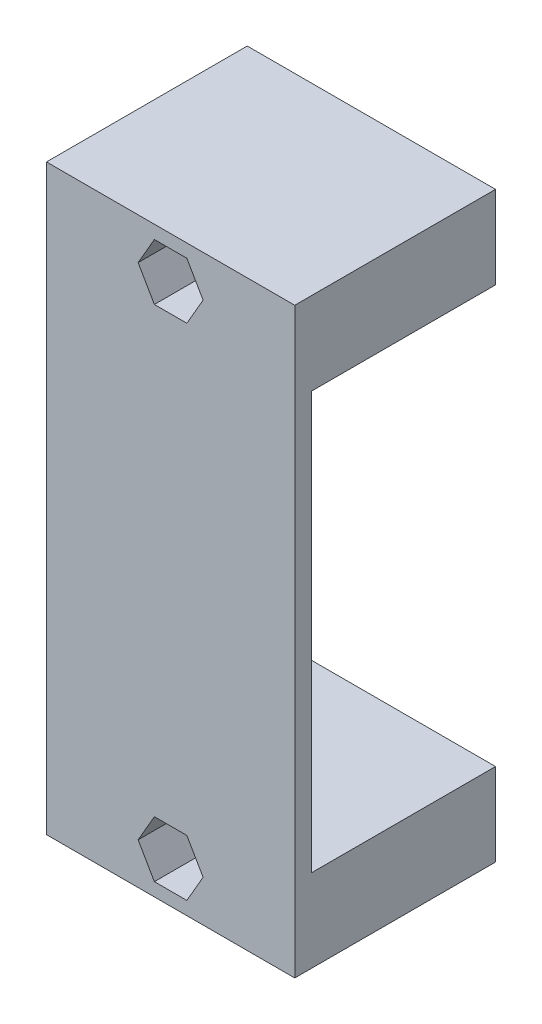
ISO-10303-21;
HEADER;
FILE_DESCRIPTION(('STEP AP214'),'2;1');
FILE_NAME('part.step','',(''),(''),'','','');
FILE_SCHEMA(('AUTOMOTIVE_DESIGN { 1 0 10303 214 1 1 1 1 }'));
ENDSEC;
DATA;
#1=APPLICATION_CONTEXT('core data for automotive mechanical design processes');
#2=APPLICATION_PROTOCOL_DEFINITION('international standard','automotive_design',2000,#1);
#3=PRODUCT_CONTEXT('',#1,'mechanical');
#4=PRODUCT('Part','Part','',(#3));
#5=PRODUCT_RELATED_PRODUCT_CATEGORY('part','',(#4));
#6=PRODUCT_DEFINITION_FORMATION('','',#4);
#7=PRODUCT_DEFINITION_CONTEXT('part definition',#1,'design');
#8=PRODUCT_DEFINITION('design','',#6,#7);
#9=PRODUCT_DEFINITION_SHAPE('','',#8);
#10=(LENGTH_UNIT() NAMED_UNIT(*) SI_UNIT(.MILLI.,.METRE.));
#11=(NAMED_UNIT(*) PLANE_ANGLE_UNIT() SI_UNIT($,.RADIAN.));
#12=(NAMED_UNIT(*) SI_UNIT($,.STERADIAN.) SOLID_ANGLE_UNIT());
#13=UNCERTAINTY_MEASURE_WITH_UNIT(LENGTH_MEASURE(1.E-05),#10,'distance_accuracy_value','');
#14=(GEOMETRIC_REPRESENTATION_CONTEXT(3) GLOBAL_UNCERTAINTY_ASSIGNED_CONTEXT((#13)) GLOBAL_UNIT_ASSIGNED_CONTEXT((#10,
#11,#12)) REPRESENTATION_CONTEXT('',''));
#15=CARTESIAN_POINT('',(0.,0.,0.));
#16=DIRECTION('',(0.,0.,1.));
#17=DIRECTION('',(1.,0.,0.));
#18=AXIS2_PLACEMENT_3D('',#15,#16,#17);
#19=CARTESIAN_POINT('',(-22.5,-27.,2.));
#20=DIRECTION('',(0.,0.,-1.));
#21=DIRECTION('',(-1.,0.,0.));
#22=AXIS2_PLACEMENT_3D('',#19,#20,#21);
#23=CYLINDRICAL_SURFACE('',#22,2.);
#24=CARTESIAN_POINT('',(-22.5,-27.,-22.26));
#25=DIRECTION('',(0.,0.,-1.));
#26=DIRECTION('',(0.,-1.,0.));
#27=AXIS2_PLACEMENT_3D('',#24,#25,#26);
#28=CIRCLE('',#27,1.99999999999997);
#29=CARTESIAN_POINT('',(-22.5,-29.,-22.26));
#30=VERTEX_POINT('',#29);
#31=EDGE_CURVE('E296',#30,#30,#28,.T.);
#32=ORIENTED_EDGE('',*,*,#31,.T.);
#33=EDGE_LOOP('',(#32));
#34=FACE_BOUND('',#33,.T.);
#35=CARTESIAN_POINT('',(-22.5,-27.,-12.));
#36=DIRECTION('',(0.,0.,1.));
#37=DIRECTION('',(1.,0.,0.));
#38=AXIS2_PLACEMENT_3D('',#35,#36,#37);
#39=CIRCLE('',#38,2.);
#40=CARTESIAN_POINT('',(-20.5,-27.,-12.));
#41=VERTEX_POINT('',#40);
#42=EDGE_CURVE('E39',#41,#41,#39,.T.);
#43=ORIENTED_EDGE('',*,*,#42,.T.);
#44=EDGE_LOOP('',(#43));
#45=FACE_BOUND('',#44,.T.);
#46=ADVANCED_FACE('F35',(#34,#45),#23,.F.);
#47=CARTESIAN_POINT('',(-22.5,33.4,2.));
#48=DIRECTION('',(0.,0.,-1.));
#49=DIRECTION('',(-1.,0.,0.));
#50=AXIS2_PLACEMENT_3D('',#47,#48,#49);
#51=CYLINDRICAL_SURFACE('',#50,2.);
#52=CARTESIAN_POINT('',(-22.5,33.4,-22.26));
#53=DIRECTION('',(0.,0.,-1.));
#54=DIRECTION('',(0.,-1.,0.));
#55=AXIS2_PLACEMENT_3D('',#52,#53,#54);
#56=CIRCLE('',#55,2.);
#57=CARTESIAN_POINT('',(-22.5,31.4,-22.26));
#58=VERTEX_POINT('',#57);
#59=EDGE_CURVE('E274',#58,#58,#56,.T.);
#60=ORIENTED_EDGE('',*,*,#59,.T.);
#61=EDGE_LOOP('',(#60));
#62=FACE_BOUND('',#61,.T.);
#63=CARTESIAN_POINT('',(-22.5,33.4,-12.));
#64=DIRECTION('',(0.,0.,1.));
#65=DIRECTION('',(1.,0.,0.));
#66=AXIS2_PLACEMENT_3D('',#63,#64,#65);
#67=CIRCLE('',#66,2.);
#68=CARTESIAN_POINT('',(-20.5,33.4,-12.));
#69=VERTEX_POINT('',#68);
#70=EDGE_CURVE('E221',#69,#69,#67,.T.);
#71=ORIENTED_EDGE('',*,*,#70,.T.);
#72=EDGE_LOOP('',(#71));
#73=FACE_BOUND('',#72,.T.);
#74=ADVANCED_FACE('F423',(#62,#73),#51,.F.);
#75=CARTESIAN_POINT('',(0.,0.,0.));
#76=DIRECTION('',(0.,0.,-1.));
#77=DIRECTION('',(-1.,0.,0.));
#78=AXIS2_PLACEMENT_3D('',#75,#76,#77);
#79=PLANE('',#78);
#80=DIRECTION('',(0.,-1.,0.));
#81=VECTOR('',#80,1.);
#82=CARTESIAN_POINT('',(-37.5,-32.,0.));
#83=LINE('',#82,#81);
#84=CARTESIAN_POINT('',(-37.5,28.4,0.));
#85=VERTEX_POINT('',#84);
#86=CARTESIAN_POINT('',(-37.5,-22.,0.));
#87=VERTEX_POINT('',#86);
#88=EDGE_CURVE('E299',#85,#87,#83,.T.);
#89=ORIENTED_EDGE('',*,*,#88,.F.);
#90=DIRECTION('',(-1.,0.,0.));
#91=VECTOR('',#90,1.);
#92=CARTESIAN_POINT('',(0.,28.4,0.));
#93=LINE('',#92,#91);
#94=CARTESIAN_POINT('',(-7.49999999999999,28.4,0.));
#95=VERTEX_POINT('',#94);
#96=EDGE_CURVE('E287',#95,#85,#93,.T.);
#97=ORIENTED_EDGE('',*,*,#96,.F.);
#98=DIRECTION('',(0.,1.,0.));
#99=VECTOR('',#98,1.);
#100=CARTESIAN_POINT('',(-7.49999999999999,-32.,0.));
#101=LINE('',#100,#99);
#102=CARTESIAN_POINT('',(-7.49999999999999,-22.,0.));
#103=VERTEX_POINT('',#102);
#104=EDGE_CURVE('E322',#103,#95,#101,.T.);
#105=ORIENTED_EDGE('',*,*,#104,.F.);
#106=DIRECTION('',(1.,0.,0.));
#107=VECTOR('',#106,1.);
#108=CARTESIAN_POINT('',(0.,-22.,0.));
#109=LINE('',#108,#107);
#110=EDGE_CURVE('E277',#87,#103,#109,.T.);
#111=ORIENTED_EDGE('',*,*,#110,.F.);
#112=EDGE_LOOP('',(#89,#97,#105,#111));
#113=FACE_BOUND('',#112,.T.);
#114=ADVANCED_FACE('F372',(#113),#79,.T.);
#115=CARTESIAN_POINT('',(0.,0.,2.));
#116=DIRECTION('',(0.,0.,-1.));
#117=DIRECTION('',(-1.,0.,0.));
#118=AXIS2_PLACEMENT_3D('',#115,#116,#117);
#119=PLANE('',#118);
#120=DIRECTION('',(1.,0.,0.));
#121=VECTOR('',#120,1.);
#122=CARTESIAN_POINT('',(-24.4629909152447,30.,2.));
#123=LINE('',#122,#121);
#124=CARTESIAN_POINT('',(-24.4629909152447,30.,2.));
#125=VERTEX_POINT('',#124);
#126=CARTESIAN_POINT('',(-20.5370090847552,30.,2.));
#127=VERTEX_POINT('',#126);
#128=EDGE_CURVE('E208',#125,#127,#123,.T.);
#129=ORIENTED_EDGE('',*,*,#128,.F.);
#130=DIRECTION('',(0.5,-0.866025403784439,0.));
#131=VECTOR('',#130,1.);
#132=CARTESIAN_POINT('',(-26.4259818304894,33.4,2.));
#133=LINE('',#132,#131);
#134=CARTESIAN_POINT('',(-26.4259818304894,33.4,2.));
#135=VERTEX_POINT('',#134);
#136=EDGE_CURVE('E52',#135,#125,#133,.T.);
#137=ORIENTED_EDGE('',*,*,#136,.F.);
#138=DIRECTION('',(-0.500000000000001,-0.866025403784438,0.));
#139=VECTOR('',#138,1.);
#140=CARTESIAN_POINT('',(-24.4629909152447,36.8,2.));
#141=LINE('',#140,#139);
#142=CARTESIAN_POINT('',(-24.4629909152447,36.8,2.));
#143=VERTEX_POINT('',#142);
#144=EDGE_CURVE('E194',#143,#135,#141,.T.);
#145=ORIENTED_EDGE('',*,*,#144,.F.);
#146=DIRECTION('',(-1.,0.,0.));
#147=VECTOR('',#146,1.);
#148=CARTESIAN_POINT('',(-20.5370090847553,36.8,2.));
#149=LINE('',#148,#147);
#150=CARTESIAN_POINT('',(-20.5370090847553,36.8,2.));
#151=VERTEX_POINT('',#150);
#152=EDGE_CURVE('E197',#151,#143,#149,.T.);
#153=ORIENTED_EDGE('',*,*,#152,.F.);
#154=DIRECTION('',(-0.5,0.866025403784439,0.));
#155=VECTOR('',#154,1.);
#156=CARTESIAN_POINT('',(-18.5740181695105,33.4,2.));
#157=LINE('',#156,#155);
#158=CARTESIAN_POINT('',(-18.5740181695105,33.4,2.));
#159=VERTEX_POINT('',#158);
#160=EDGE_CURVE('E214',#159,#151,#157,.T.);
#161=ORIENTED_EDGE('',*,*,#160,.F.);
#162=DIRECTION('',(0.499999999999999,0.866025403784439,0.));
#163=VECTOR('',#162,1.);
#164=CARTESIAN_POINT('',(-20.5370090847552,30.,2.));
#165=LINE('',#164,#163);
#166=EDGE_CURVE('E211',#127,#159,#165,.T.);
#167=ORIENTED_EDGE('',*,*,#166,.F.);
#168=EDGE_LOOP('',(#129,#137,#145,#153,#161,#167));
#169=FACE_BOUND('',#168,.T.);
#170=DIRECTION('',(0.5,0.866025403784439,0.));
#171=VECTOR('',#170,1.);
#172=CARTESIAN_POINT('',(-20.5370090847553,-30.4,2.));
#173=LINE('',#172,#171);
#174=CARTESIAN_POINT('',(-20.5370090847553,-30.4,2.));
#175=VERTEX_POINT('',#174);
#176=CARTESIAN_POINT('',(-18.5740181695105,-27.,2.));
#177=VERTEX_POINT('',#176);
#178=EDGE_CURVE('E250',#175,#177,#173,.T.);
#179=ORIENTED_EDGE('',*,*,#178,.F.);
#180=DIRECTION('',(1.,0.,0.));
#181=VECTOR('',#180,1.);
#182=CARTESIAN_POINT('',(-24.4629909152447,-30.4,2.));
#183=LINE('',#182,#181);
#184=CARTESIAN_POINT('',(-24.4629909152447,-30.4,2.));
#185=VERTEX_POINT('',#184);
#186=EDGE_CURVE('E60',#185,#175,#183,.T.);
#187=ORIENTED_EDGE('',*,*,#186,.F.);
#188=DIRECTION('',(0.500000000000001,-0.866025403784438,0.));
#189=VECTOR('',#188,1.);
#190=CARTESIAN_POINT('',(-26.4259818304894,-27.,2.));
#191=LINE('',#190,#189);
#192=CARTESIAN_POINT('',(-26.4259818304894,-27.,2.));
#193=VERTEX_POINT('',#192);
#194=EDGE_CURVE('E233',#193,#185,#191,.T.);
#195=ORIENTED_EDGE('',*,*,#194,.F.);
#196=DIRECTION('',(-0.5,-0.866025403784439,0.));
#197=VECTOR('',#196,1.);
#198=CARTESIAN_POINT('',(-24.4629909152447,-23.6,2.));
#199=LINE('',#198,#197);
#200=CARTESIAN_POINT('',(-24.4629909152447,-23.6,2.));
#201=VERTEX_POINT('',#200);
#202=EDGE_CURVE('E259',#201,#193,#199,.T.);
#203=ORIENTED_EDGE('',*,*,#202,.F.);
#204=DIRECTION('',(-1.,0.,0.));
#205=VECTOR('',#204,1.);
#206=CARTESIAN_POINT('',(-20.5370090847552,-23.6,2.));
#207=LINE('',#206,#205);
#208=CARTESIAN_POINT('',(-20.5370090847552,-23.6,2.));
#209=VERTEX_POINT('',#208);
#210=EDGE_CURVE('E256',#209,#201,#207,.T.);
#211=ORIENTED_EDGE('',*,*,#210,.F.);
#212=DIRECTION('',(-0.499999999999999,0.866025403784439,0.));
#213=VECTOR('',#212,1.);
#214=CARTESIAN_POINT('',(-18.5740181695105,-27.,2.));
#215=LINE('',#214,#213);
#216=EDGE_CURVE('E253',#177,#209,#215,.T.);
#217=ORIENTED_EDGE('',*,*,#216,.F.);
#218=EDGE_LOOP('',(#179,#187,#195,#203,#211,#217));
#219=FACE_BOUND('',#218,.T.);
#220=DIRECTION('',(0.,-1.,0.));
#221=VECTOR('',#220,1.);
#222=CARTESIAN_POINT('',(-37.5,-32.,2.));
#223=LINE('',#222,#221);
#224=CARTESIAN_POINT('',(-37.5,38.4,2.));
#225=VERTEX_POINT('',#224);
#226=CARTESIAN_POINT('',(-37.5,-32.,2.));
#227=VERTEX_POINT('',#226);
#228=EDGE_CURVE('E318',#225,#227,#223,.T.);
#229=ORIENTED_EDGE('',*,*,#228,.T.);
#230=DIRECTION('',(1.,0.,0.));
#231=VECTOR('',#230,1.);
#232=CARTESIAN_POINT('',(-37.5,-32.,2.));
#233=LINE('',#232,#231);
#234=CARTESIAN_POINT('',(-7.49999999999999,-32.,2.));
#235=VERTEX_POINT('',#234);
#236=EDGE_CURVE('E321',#227,#235,#233,.T.);
#237=ORIENTED_EDGE('',*,*,#236,.T.);
#238=DIRECTION('',(0.,1.,0.));
#239=VECTOR('',#238,1.);
#240=CARTESIAN_POINT('',(-7.49999999999999,-32.,2.));
#241=LINE('',#240,#239);
#242=CARTESIAN_POINT('',(-7.49999999999999,38.4,2.));
#243=VERTEX_POINT('',#242);
#244=EDGE_CURVE('E324',#235,#243,#241,.T.);
#245=ORIENTED_EDGE('',*,*,#244,.T.);
#246=DIRECTION('',(-1.,0.,0.));
#247=VECTOR('',#246,1.);
#248=CARTESIAN_POINT('',(-37.5,38.4,2.));
#249=LINE('',#248,#247);
#250=EDGE_CURVE('E326',#243,#225,#249,.T.);
#251=ORIENTED_EDGE('',*,*,#250,.T.);
#252=EDGE_LOOP('',(#229,#237,#245,#251));
#253=FACE_BOUND('',#252,.T.);
#254=ADVANCED_FACE('F369',(#169,#219,#253),#119,.F.);
#255=CARTESIAN_POINT('',(-37.5,-32.,2.));
#256=DIRECTION('',(1.,0.,0.));
#257=DIRECTION('',(0.,0.,-1.));
#258=AXIS2_PLACEMENT_3D('',#255,#256,#257);
#259=PLANE('',#258);
#260=DIRECTION('',(0.,0.,-1.));
#261=VECTOR('',#260,1.);
#262=CARTESIAN_POINT('',(-37.5,38.4,2.));
#263=LINE('',#262,#261);
#264=CARTESIAN_POINT('',(-37.5,38.4,-22.26));
#265=VERTEX_POINT('',#264);
#266=EDGE_CURVE('E328',#225,#265,#263,.T.);
#267=ORIENTED_EDGE('',*,*,#266,.T.);
#268=DIRECTION('',(0.,1.,0.));
#269=VECTOR('',#268,1.);
#270=CARTESIAN_POINT('',(-37.5,0.,-22.26));
#271=LINE('',#270,#269);
#272=CARTESIAN_POINT('',(-37.5,28.4,-22.26));
#273=VERTEX_POINT('',#272);
#274=EDGE_CURVE('E282',#273,#265,#271,.T.);
#275=ORIENTED_EDGE('',*,*,#274,.F.);
#276=DIRECTION('',(0.,0.,1.));
#277=VECTOR('',#276,1.);
#278=CARTESIAN_POINT('',(-37.5,28.4,-53.8827766016838));
#279=LINE('',#278,#277);
#280=EDGE_CURVE('E291',#273,#85,#279,.T.);
#281=ORIENTED_EDGE('',*,*,#280,.T.);
#282=ORIENTED_EDGE('',*,*,#88,.T.);
#283=DIRECTION('',(0.,0.,1.));
#284=VECTOR('',#283,1.);
#285=CARTESIAN_POINT('',(-37.5,-22.,-53.8827766016838));
#286=LINE('',#285,#284);
#287=CARTESIAN_POINT('',(-37.5,-22.,-22.26));
#288=VERTEX_POINT('',#287);
#289=EDGE_CURVE('E311',#288,#87,#286,.T.);
#290=ORIENTED_EDGE('',*,*,#289,.F.);
#291=DIRECTION('',(0.,1.,0.));
#292=VECTOR('',#291,1.);
#293=CARTESIAN_POINT('',(-37.5,0.,-22.26));
#294=LINE('',#293,#292);
#295=CARTESIAN_POINT('',(-37.5,-32.,-22.26));
#296=VERTEX_POINT('',#295);
#297=EDGE_CURVE('E303',#296,#288,#294,.T.);
#298=ORIENTED_EDGE('',*,*,#297,.F.);
#299=DIRECTION('',(0.,0.,-1.));
#300=VECTOR('',#299,1.);
#301=CARTESIAN_POINT('',(-37.5,-32.,2.));
#302=LINE('',#301,#300);
#303=EDGE_CURVE('E11',#227,#296,#302,.T.);
#304=ORIENTED_EDGE('',*,*,#303,.F.);
#305=ORIENTED_EDGE('',*,*,#228,.F.);
#306=EDGE_LOOP('',(#267,#275,#281,#282,#290,#298,#304,#305));
#307=FACE_BOUND('',#306,.T.);
#308=ADVANCED_FACE('F37',(#307),#259,.F.);
#309=CARTESIAN_POINT('',(-37.5,-32.,2.));
#310=DIRECTION('',(0.,1.,0.));
#311=DIRECTION('',(0.,0.,1.));
#312=AXIS2_PLACEMENT_3D('',#309,#310,#311);
#313=PLANE('',#312);
#314=ORIENTED_EDGE('',*,*,#303,.T.);
#315=DIRECTION('',(1.,0.,0.));
#316=VECTOR('',#315,1.);
#317=CARTESIAN_POINT('',(0.,-32.,-22.26));
#318=LINE('',#317,#316);
#319=CARTESIAN_POINT('',(-7.49999999999999,-32.,-22.26));
#320=VERTEX_POINT('',#319);
#321=EDGE_CURVE('E300',#296,#320,#318,.T.);
#322=ORIENTED_EDGE('',*,*,#321,.T.);
#323=DIRECTION('',(0.,0.,-1.));
#324=VECTOR('',#323,1.);
#325=CARTESIAN_POINT('',(-7.49999999999999,-32.,2.));
#326=LINE('',#325,#324);
#327=EDGE_CURVE('E44',#235,#320,#326,.T.);
#328=ORIENTED_EDGE('',*,*,#327,.F.);
#329=ORIENTED_EDGE('',*,*,#236,.F.);
#330=EDGE_LOOP('',(#314,#322,#328,#329));
#331=FACE_BOUND('',#330,.T.);
#332=ADVANCED_FACE('F385',(#331),#313,.F.);
#333=CARTESIAN_POINT('',(-7.49999999999999,-32.,2.));
#334=DIRECTION('',(-1.,0.,0.));
#335=DIRECTION('',(0.,0.,1.));
#336=AXIS2_PLACEMENT_3D('',#333,#334,#335);
#337=PLANE('',#336);
#338=ORIENTED_EDGE('',*,*,#327,.T.);
#339=DIRECTION('',(0.,1.,0.));
#340=VECTOR('',#339,1.);
#341=CARTESIAN_POINT('',(-7.49999999999999,0.,-22.26));
#342=LINE('',#341,#340);
#343=CARTESIAN_POINT('',(-7.49999999999999,-22.,-22.26));
#344=VERTEX_POINT('',#343);
#345=EDGE_CURVE('E304',#320,#344,#342,.T.);
#346=ORIENTED_EDGE('',*,*,#345,.T.);
#347=DIRECTION('',(0.,0.,1.));
#348=VECTOR('',#347,1.);
#349=CARTESIAN_POINT('',(-7.49999999999999,-22.,-53.8827766016838));
#350=LINE('',#349,#348);
#351=EDGE_CURVE('E310',#344,#103,#350,.T.);
#352=ORIENTED_EDGE('',*,*,#351,.T.);
#353=ORIENTED_EDGE('',*,*,#104,.T.);
#354=DIRECTION('',(0.,0.,1.));
#355=VECTOR('',#354,1.);
#356=CARTESIAN_POINT('',(-7.49999999999999,28.4,-53.8827766016838));
#357=LINE('',#356,#355);
#358=CARTESIAN_POINT('',(-7.49999999999999,28.4,-22.26));
#359=VERTEX_POINT('',#358);
#360=EDGE_CURVE('E290',#359,#95,#357,.T.);
#361=ORIENTED_EDGE('',*,*,#360,.F.);
#362=DIRECTION('',(0.,1.,0.));
#363=VECTOR('',#362,1.);
#364=CARTESIAN_POINT('',(-7.49999999999999,0.,-22.26));
#365=LINE('',#364,#363);
#366=CARTESIAN_POINT('',(-7.49999999999999,38.4,-22.26));
#367=VERTEX_POINT('',#366);
#368=EDGE_CURVE('E283',#359,#367,#365,.T.);
#369=ORIENTED_EDGE('',*,*,#368,.T.);
#370=DIRECTION('',(0.,0.,-1.));
#371=VECTOR('',#370,1.);
#372=CARTESIAN_POINT('',(-7.49999999999999,38.4,2.));
#373=LINE('',#372,#371);
#374=EDGE_CURVE('E333',#243,#367,#373,.T.);
#375=ORIENTED_EDGE('',*,*,#374,.F.);
#376=ORIENTED_EDGE('',*,*,#244,.F.);
#377=EDGE_LOOP('',(#338,#346,#352,#353,#361,#369,#375,#376));
#378=FACE_BOUND('',#377,.T.);
#379=ADVANCED_FACE('F393',(#378),#337,.F.);
#380=CARTESIAN_POINT('',(-37.5,38.4,2.));
#381=DIRECTION('',(0.,-1.,0.));
#382=DIRECTION('',(0.,0.,-1.));
#383=AXIS2_PLACEMENT_3D('',#380,#381,#382);
#384=PLANE('',#383);
#385=ORIENTED_EDGE('',*,*,#374,.T.);
#386=DIRECTION('',(1.,0.,0.));
#387=VECTOR('',#386,1.);
#388=CARTESIAN_POINT('',(0.,38.4,-22.26));
#389=LINE('',#388,#387);
#390=EDGE_CURVE('E279',#265,#367,#389,.T.);
#391=ORIENTED_EDGE('',*,*,#390,.F.);
#392=ORIENTED_EDGE('',*,*,#266,.F.);
#393=ORIENTED_EDGE('',*,*,#250,.F.);
#394=EDGE_LOOP('',(#385,#391,#392,#393));
#395=FACE_BOUND('',#394,.T.);
#396=ADVANCED_FACE('F399',(#395),#384,.F.);
#397=CARTESIAN_POINT('',(0.,-22.,-53.8827766016838));
#398=DIRECTION('',(0.,-1.,0.));
#399=DIRECTION('',(0.,0.,-1.));
#400=AXIS2_PLACEMENT_3D('',#397,#398,#399);
#401=PLANE('',#400);
#402=DIRECTION('',(1.,0.,0.));
#403=VECTOR('',#402,1.);
#404=CARTESIAN_POINT('',(0.,-22.,-22.26));
#405=LINE('',#404,#403);
#406=EDGE_CURVE('E301',#288,#344,#405,.T.);
#407=ORIENTED_EDGE('',*,*,#406,.F.);
#408=ORIENTED_EDGE('',*,*,#289,.T.);
#409=ORIENTED_EDGE('',*,*,#110,.T.);
#410=ORIENTED_EDGE('',*,*,#351,.F.);
#411=EDGE_LOOP('',(#407,#408,#409,#410));
#412=FACE_BOUND('',#411,.T.);
#413=ADVANCED_FACE('F412',(#412),#401,.F.);
#414=CARTESIAN_POINT('',(-280.5,-211.6,-22.2600000000001));
#415=DIRECTION('',(0.,0.,-1.));
#416=DIRECTION('',(0.,-1.,0.));
#417=AXIS2_PLACEMENT_3D('',#414,#415,#416);
#418=PLANE('',#417);
#419=ORIENTED_EDGE('',*,*,#297,.T.);
#420=ORIENTED_EDGE('',*,*,#406,.T.);
#421=ORIENTED_EDGE('',*,*,#345,.F.);
#422=ORIENTED_EDGE('',*,*,#321,.F.);
#423=EDGE_LOOP('',(#419,#420,#421,#422));
#424=FACE_BOUND('',#423,.T.);
#425=ORIENTED_EDGE('',*,*,#31,.F.);
#426=EDGE_LOOP('',(#425));
#427=FACE_BOUND('',#426,.T.);
#428=ADVANCED_FACE('F388',(#424,#427),#418,.T.);
#429=CARTESIAN_POINT('',(0.,28.4,-53.8827766016838));
#430=DIRECTION('',(0.,1.,0.));
#431=DIRECTION('',(0.,0.,1.));
#432=AXIS2_PLACEMENT_3D('',#429,#430,#431);
#433=PLANE('',#432);
#434=DIRECTION('',(-1.,0.,0.));
#435=VECTOR('',#434,1.);
#436=CARTESIAN_POINT('',(0.,28.4,-22.26));
#437=LINE('',#436,#435);
#438=EDGE_CURVE('E278',#359,#273,#437,.T.);
#439=ORIENTED_EDGE('',*,*,#438,.F.);
#440=ORIENTED_EDGE('',*,*,#360,.T.);
#441=ORIENTED_EDGE('',*,*,#96,.T.);
#442=ORIENTED_EDGE('',*,*,#280,.F.);
#443=EDGE_LOOP('',(#439,#440,#441,#442));
#444=FACE_BOUND('',#443,.T.);
#445=ADVANCED_FACE('F406',(#444),#433,.F.);
#446=CARTESIAN_POINT('',(-280.5,-211.6,-22.2600000000001));
#447=DIRECTION('',(0.,0.,-1.));
#448=DIRECTION('',(0.,-1.,0.));
#449=AXIS2_PLACEMENT_3D('',#446,#447,#448);
#450=PLANE('',#449);
#451=ORIENTED_EDGE('',*,*,#59,.F.);
#452=EDGE_LOOP('',(#451));
#453=FACE_BOUND('',#452,.T.);
#454=ORIENTED_EDGE('',*,*,#438,.T.);
#455=ORIENTED_EDGE('',*,*,#274,.T.);
#456=ORIENTED_EDGE('',*,*,#390,.T.);
#457=ORIENTED_EDGE('',*,*,#368,.F.);
#458=EDGE_LOOP('',(#454,#455,#456,#457));
#459=FACE_BOUND('',#458,.T.);
#460=ADVANCED_FACE('F402',(#453,#459),#450,.T.);
#461=CARTESIAN_POINT('',(-26.4259818304894,33.4,-12.));
#462=DIRECTION('',(-0.866025403784439,-0.5,0.));
#463=DIRECTION('',(0.5,-0.866025403784439,0.));
#464=AXIS2_PLACEMENT_3D('',#461,#462,#463);
#465=PLANE('',#464);
#466=ORIENTED_EDGE('',*,*,#136,.T.);
#467=DIRECTION('',(0.,0.,1.));
#468=VECTOR('',#467,1.);
#469=CARTESIAN_POINT('',(-24.4629909152447,30.,-12.));
#470=LINE('',#469,#468);
#471=CARTESIAN_POINT('',(-24.4629909152447,30.,-12.));
#472=VERTEX_POINT('',#471);
#473=EDGE_CURVE('E171',#472,#125,#470,.T.);
#474=ORIENTED_EDGE('',*,*,#473,.F.);
#475=DIRECTION('',(0.5,-0.866025403784439,0.));
#476=VECTOR('',#475,1.);
#477=CARTESIAN_POINT('',(-26.4259818304894,33.4,-12.));
#478=LINE('',#477,#476);
#479=CARTESIAN_POINT('',(-26.4259818304894,33.4,-12.));
#480=VERTEX_POINT('',#479);
#481=EDGE_CURVE('E175',#480,#472,#478,.T.);
#482=ORIENTED_EDGE('',*,*,#481,.F.);
#483=DIRECTION('',(0.,0.,1.));
#484=VECTOR('',#483,1.);
#485=CARTESIAN_POINT('',(-26.4259818304894,33.4,-12.));
#486=LINE('',#485,#484);
#487=EDGE_CURVE('E219',#480,#135,#486,.T.);
#488=ORIENTED_EDGE('',*,*,#487,.T.);
#489=EDGE_LOOP('',(#466,#474,#482,#488));
#490=FACE_BOUND('',#489,.T.);
#491=ADVANCED_FACE('F173',(#490),#465,.F.);
#492=CARTESIAN_POINT('',(-24.4629909152447,36.8,-12.));
#493=DIRECTION('',(-0.866025403784438,0.500000000000001,0.));
#494=DIRECTION('',(-0.500000000000001,-0.866025403784438,0.));
#495=AXIS2_PLACEMENT_3D('',#492,#493,#494);
#496=PLANE('',#495);
#497=ORIENTED_EDGE('',*,*,#144,.T.);
#498=ORIENTED_EDGE('',*,*,#487,.F.);
#499=DIRECTION('',(-0.500000000000001,-0.866025403784438,0.));
#500=VECTOR('',#499,1.);
#501=CARTESIAN_POINT('',(-24.4629909152447,36.8,-12.));
#502=LINE('',#501,#500);
#503=CARTESIAN_POINT('',(-24.4629909152447,36.8,-12.));
#504=VERTEX_POINT('',#503);
#505=EDGE_CURVE('E181',#504,#480,#502,.T.);
#506=ORIENTED_EDGE('',*,*,#505,.F.);
#507=DIRECTION('',(0.,0.,1.));
#508=VECTOR('',#507,1.);
#509=CARTESIAN_POINT('',(-24.4629909152447,36.8,-12.));
#510=LINE('',#509,#508);
#511=EDGE_CURVE('E222',#504,#143,#510,.T.);
#512=ORIENTED_EDGE('',*,*,#511,.T.);
#513=EDGE_LOOP('',(#497,#498,#506,#512));
#514=FACE_BOUND('',#513,.T.);
#515=ADVANCED_FACE('F546',(#514),#496,.F.);
#516=CARTESIAN_POINT('',(-20.5370090847553,36.8,-12.));
#517=DIRECTION('',(0.,1.,0.));
#518=DIRECTION('',(0.,0.,1.));
#519=AXIS2_PLACEMENT_3D('',#516,#517,#518);
#520=PLANE('',#519);
#521=ORIENTED_EDGE('',*,*,#152,.T.);
#522=ORIENTED_EDGE('',*,*,#511,.F.);
#523=DIRECTION('',(-1.,0.,0.));
#524=VECTOR('',#523,1.);
#525=CARTESIAN_POINT('',(-20.5370090847553,36.8,-12.));
#526=LINE('',#525,#524);
#527=CARTESIAN_POINT('',(-20.5370090847553,36.8,-12.));
#528=VERTEX_POINT('',#527);
#529=EDGE_CURVE('E204',#528,#504,#526,.T.);
#530=ORIENTED_EDGE('',*,*,#529,.F.);
#531=DIRECTION('',(0.,0.,1.));
#532=VECTOR('',#531,1.);
#533=CARTESIAN_POINT('',(-20.5370090847553,36.8,-12.));
#534=LINE('',#533,#532);
#535=EDGE_CURVE('E224',#528,#151,#534,.T.);
#536=ORIENTED_EDGE('',*,*,#535,.T.);
#537=EDGE_LOOP('',(#521,#522,#530,#536));
#538=FACE_BOUND('',#537,.T.);
#539=ADVANCED_FACE('F556',(#538),#520,.F.);
#540=CARTESIAN_POINT('',(-18.5740181695105,33.4,-12.));
#541=DIRECTION('',(0.866025403784439,0.5,0.));
#542=DIRECTION('',(-0.5,0.866025403784439,0.));
#543=AXIS2_PLACEMENT_3D('',#540,#541,#542);
#544=PLANE('',#543);
#545=ORIENTED_EDGE('',*,*,#160,.T.);
#546=ORIENTED_EDGE('',*,*,#535,.F.);
#547=DIRECTION('',(-0.5,0.866025403784439,0.));
#548=VECTOR('',#547,1.);
#549=CARTESIAN_POINT('',(-18.5740181695105,33.4,-12.));
#550=LINE('',#549,#548);
#551=CARTESIAN_POINT('',(-18.5740181695105,33.4,-12.));
#552=VERTEX_POINT('',#551);
#553=EDGE_CURVE('E201',#552,#528,#550,.T.);
#554=ORIENTED_EDGE('',*,*,#553,.F.);
#555=DIRECTION('',(0.,0.,1.));
#556=VECTOR('',#555,1.);
#557=CARTESIAN_POINT('',(-18.5740181695105,33.4,-12.));
#558=LINE('',#557,#556);
#559=EDGE_CURVE('E226',#552,#159,#558,.T.);
#560=ORIENTED_EDGE('',*,*,#559,.T.);
#561=EDGE_LOOP('',(#545,#546,#554,#560));
#562=FACE_BOUND('',#561,.T.);
#563=ADVANCED_FACE('F552',(#562),#544,.F.);
#564=CARTESIAN_POINT('',(-20.5370090847552,30.,-12.));
#565=DIRECTION('',(0.866025403784439,-0.499999999999999,0.));
#566=DIRECTION('',(0.499999999999999,0.866025403784439,0.));
#567=AXIS2_PLACEMENT_3D('',#564,#565,#566);
#568=PLANE('',#567);
#569=ORIENTED_EDGE('',*,*,#166,.T.);
#570=ORIENTED_EDGE('',*,*,#559,.F.);
#571=DIRECTION('',(0.499999999999999,0.866025403784439,0.));
#572=VECTOR('',#571,1.);
#573=CARTESIAN_POINT('',(-20.5370090847552,30.,-12.));
#574=LINE('',#573,#572);
#575=CARTESIAN_POINT('',(-20.5370090847552,30.,-12.));
#576=VERTEX_POINT('',#575);
#577=EDGE_CURVE('E189',#576,#552,#574,.T.);
#578=ORIENTED_EDGE('',*,*,#577,.F.);
#579=DIRECTION('',(0.,0.,1.));
#580=VECTOR('',#579,1.);
#581=CARTESIAN_POINT('',(-20.5370090847552,30.,-12.));
#582=LINE('',#581,#580);
#583=EDGE_CURVE('E180',#576,#127,#582,.T.);
#584=ORIENTED_EDGE('',*,*,#583,.T.);
#585=EDGE_LOOP('',(#569,#570,#578,#584));
#586=FACE_BOUND('',#585,.T.);
#587=ADVANCED_FACE('F549',(#586),#568,.F.);
#588=CARTESIAN_POINT('',(-24.4629909152447,30.,-12.));
#589=DIRECTION('',(0.,-1.,0.));
#590=DIRECTION('',(0.,0.,-1.));
#591=AXIS2_PLACEMENT_3D('',#588,#589,#590);
#592=PLANE('',#591);
#593=ORIENTED_EDGE('',*,*,#128,.T.);
#594=ORIENTED_EDGE('',*,*,#583,.F.);
#595=DIRECTION('',(1.,0.,0.));
#596=VECTOR('',#595,1.);
#597=CARTESIAN_POINT('',(-24.4629909152447,30.,-12.));
#598=LINE('',#597,#596);
#599=EDGE_CURVE('E184',#472,#576,#598,.T.);
#600=ORIENTED_EDGE('',*,*,#599,.F.);
#601=ORIENTED_EDGE('',*,*,#473,.T.);
#602=EDGE_LOOP('',(#593,#594,#600,#601));
#603=FACE_BOUND('',#602,.T.);
#604=ADVANCED_FACE('F185',(#603),#592,.F.);
#605=CARTESIAN_POINT('',(0.,0.,-12.));
#606=DIRECTION('',(0.,0.,1.));
#607=DIRECTION('',(1.,0.,0.));
#608=AXIS2_PLACEMENT_3D('',#605,#606,#607);
#609=PLANE('',#608);
#610=ORIENTED_EDGE('',*,*,#70,.F.);
#611=EDGE_LOOP('',(#610));
#612=FACE_BOUND('',#611,.T.);
#613=ORIENTED_EDGE('',*,*,#481,.T.);
#614=ORIENTED_EDGE('',*,*,#599,.T.);
#615=ORIENTED_EDGE('',*,*,#577,.T.);
#616=ORIENTED_EDGE('',*,*,#553,.T.);
#617=ORIENTED_EDGE('',*,*,#529,.T.);
#618=ORIENTED_EDGE('',*,*,#505,.T.);
#619=EDGE_LOOP('',(#613,#614,#615,#616,#617,#618));
#620=FACE_BOUND('',#619,.T.);
#621=ADVANCED_FACE('F191',(#612,#620),#609,.T.);
#622=CARTESIAN_POINT('',(-24.4629909152447,-30.4,-12.));
#623=DIRECTION('',(0.,-1.,0.));
#624=DIRECTION('',(0.,0.,-1.));
#625=AXIS2_PLACEMENT_3D('',#622,#623,#624);
#626=PLANE('',#625);
#627=ORIENTED_EDGE('',*,*,#186,.T.);
#628=DIRECTION('',(0.,0.,1.));
#629=VECTOR('',#628,1.);
#630=CARTESIAN_POINT('',(-20.5370090847553,-30.4,-12.));
#631=LINE('',#630,#629);
#632=CARTESIAN_POINT('',(-20.5370090847553,-30.4,-12.));
#633=VERTEX_POINT('',#632);
#634=EDGE_CURVE('E248',#633,#175,#631,.T.);
#635=ORIENTED_EDGE('',*,*,#634,.F.);
#636=DIRECTION('',(1.,0.,0.));
#637=VECTOR('',#636,1.);
#638=CARTESIAN_POINT('',(-24.4629909152447,-30.4,-12.));
#639=LINE('',#638,#637);
#640=CARTESIAN_POINT('',(-24.4629909152447,-30.4,-12.));
#641=VERTEX_POINT('',#640);
#642=EDGE_CURVE('E229',#641,#633,#639,.T.);
#643=ORIENTED_EDGE('',*,*,#642,.F.);
#644=DIRECTION('',(0.,0.,1.));
#645=VECTOR('',#644,1.);
#646=CARTESIAN_POINT('',(-24.4629909152447,-30.4,-12.));
#647=LINE('',#646,#645);
#648=EDGE_CURVE('E209',#641,#185,#647,.T.);
#649=ORIENTED_EDGE('',*,*,#648,.T.);
#650=EDGE_LOOP('',(#627,#635,#643,#649));
#651=FACE_BOUND('',#650,.T.);
#652=ADVANCED_FACE('F350',(#651),#626,.F.);
#653=CARTESIAN_POINT('',(-26.4259818304894,-27.,-12.));
#654=DIRECTION('',(-0.866025403784438,-0.500000000000001,0.));
#655=DIRECTION('',(0.500000000000001,-0.866025403784438,0.));
#656=AXIS2_PLACEMENT_3D('',#653,#654,#655);
#657=PLANE('',#656);
#658=ORIENTED_EDGE('',*,*,#194,.T.);
#659=ORIENTED_EDGE('',*,*,#648,.F.);
#660=DIRECTION('',(0.500000000000001,-0.866025403784438,0.));
#661=VECTOR('',#660,1.);
#662=CARTESIAN_POINT('',(-26.4259818304894,-27.,-12.));
#663=LINE('',#662,#661);
#664=CARTESIAN_POINT('',(-26.4259818304894,-27.,-12.));
#665=VERTEX_POINT('',#664);
#666=EDGE_CURVE('E245',#665,#641,#663,.T.);
#667=ORIENTED_EDGE('',*,*,#666,.F.);
#668=DIRECTION('',(0.,0.,1.));
#669=VECTOR('',#668,1.);
#670=CARTESIAN_POINT('',(-26.4259818304894,-27.,-12.));
#671=LINE('',#670,#669);
#672=EDGE_CURVE('E265',#665,#193,#671,.T.);
#673=ORIENTED_EDGE('',*,*,#672,.T.);
#674=EDGE_LOOP('',(#658,#659,#667,#673));
#675=FACE_BOUND('',#674,.T.);
#676=ADVANCED_FACE('F367',(#675),#657,.F.);
#677=CARTESIAN_POINT('',(-24.4629909152447,-23.6,-12.));
#678=DIRECTION('',(-0.866025403784439,0.5,0.));
#679=DIRECTION('',(-0.5,-0.866025403784439,0.));
#680=AXIS2_PLACEMENT_3D('',#677,#678,#679);
#681=PLANE('',#680);
#682=ORIENTED_EDGE('',*,*,#202,.T.);
#683=ORIENTED_EDGE('',*,*,#672,.F.);
#684=DIRECTION('',(-0.5,-0.866025403784439,0.));
#685=VECTOR('',#684,1.);
#686=CARTESIAN_POINT('',(-24.4629909152447,-23.6,-12.));
#687=LINE('',#686,#685);
#688=CARTESIAN_POINT('',(-24.4629909152447,-23.6,-12.));
#689=VERTEX_POINT('',#688);
#690=EDGE_CURVE('E242',#689,#665,#687,.T.);
#691=ORIENTED_EDGE('',*,*,#690,.F.);
#692=DIRECTION('',(0.,0.,1.));
#693=VECTOR('',#692,1.);
#694=CARTESIAN_POINT('',(-24.4629909152447,-23.6,-12.));
#695=LINE('',#694,#693);
#696=EDGE_CURVE('E267',#689,#201,#695,.T.);
#697=ORIENTED_EDGE('',*,*,#696,.T.);
#698=EDGE_LOOP('',(#682,#683,#691,#697));
#699=FACE_BOUND('',#698,.T.);
#700=ADVANCED_FACE('F364',(#699),#681,.F.);
#701=CARTESIAN_POINT('',(-20.5370090847552,-23.6,-12.));
#702=DIRECTION('',(0.,1.,0.));
#703=DIRECTION('',(-1.,0.,0.));
#704=AXIS2_PLACEMENT_3D('',#701,#702,#703);
#705=PLANE('',#704);
#706=ORIENTED_EDGE('',*,*,#210,.T.);
#707=ORIENTED_EDGE('',*,*,#696,.F.);
#708=DIRECTION('',(-1.,0.,0.));
#709=VECTOR('',#708,1.);
#710=CARTESIAN_POINT('',(-20.5370090847552,-23.6,-12.));
#711=LINE('',#710,#709);
#712=CARTESIAN_POINT('',(-20.5370090847552,-23.6,-12.));
#713=VERTEX_POINT('',#712);
#714=EDGE_CURVE('E239',#713,#689,#711,.T.);
#715=ORIENTED_EDGE('',*,*,#714,.F.);
#716=DIRECTION('',(0.,0.,1.));
#717=VECTOR('',#716,1.);
#718=CARTESIAN_POINT('',(-20.5370090847552,-23.6,-12.));
#719=LINE('',#718,#717);
#720=EDGE_CURVE('E269',#713,#209,#719,.T.);
#721=ORIENTED_EDGE('',*,*,#720,.T.);
#722=EDGE_LOOP('',(#706,#707,#715,#721));
#723=FACE_BOUND('',#722,.T.);
#724=ADVANCED_FACE('F360',(#723),#705,.F.);
#725=CARTESIAN_POINT('',(-18.5740181695105,-27.,-12.));
#726=DIRECTION('',(0.866025403784439,0.499999999999999,0.));
#727=DIRECTION('',(-0.499999999999999,0.866025403784439,0.));
#728=AXIS2_PLACEMENT_3D('',#725,#726,#727);
#729=PLANE('',#728);
#730=ORIENTED_EDGE('',*,*,#216,.T.);
#731=ORIENTED_EDGE('',*,*,#720,.F.);
#732=DIRECTION('',(-0.499999999999999,0.866025403784439,0.));
#733=VECTOR('',#732,1.);
#734=CARTESIAN_POINT('',(-18.5740181695105,-27.,-12.));
#735=LINE('',#734,#733);
#736=CARTESIAN_POINT('',(-18.5740181695105,-27.,-12.));
#737=VERTEX_POINT('',#736);
#738=EDGE_CURVE('E236',#737,#713,#735,.T.);
#739=ORIENTED_EDGE('',*,*,#738,.F.);
#740=DIRECTION('',(0.,0.,1.));
#741=VECTOR('',#740,1.);
#742=CARTESIAN_POINT('',(-18.5740181695105,-27.,-12.));
#743=LINE('',#742,#741);
#744=EDGE_CURVE('E271',#737,#177,#743,.T.);
#745=ORIENTED_EDGE('',*,*,#744,.T.);
#746=EDGE_LOOP('',(#730,#731,#739,#745));
#747=FACE_BOUND('',#746,.T.);
#748=ADVANCED_FACE('F356',(#747),#729,.F.);
#749=CARTESIAN_POINT('',(-20.5370090847553,-30.4,-12.));
#750=DIRECTION('',(0.866025403784439,-0.5,0.));
#751=DIRECTION('',(0.5,0.866025403784439,0.));
#752=AXIS2_PLACEMENT_3D('',#749,#750,#751);
#753=PLANE('',#752);
#754=ORIENTED_EDGE('',*,*,#178,.T.);
#755=ORIENTED_EDGE('',*,*,#744,.F.);
#756=DIRECTION('',(0.5,0.866025403784439,0.));
#757=VECTOR('',#756,1.);
#758=CARTESIAN_POINT('',(-20.5370090847553,-30.4,-12.));
#759=LINE('',#758,#757);
#760=EDGE_CURVE('E232',#633,#737,#759,.T.);
#761=ORIENTED_EDGE('',*,*,#760,.F.);
#762=ORIENTED_EDGE('',*,*,#634,.T.);
#763=EDGE_LOOP('',(#754,#755,#761,#762));
#764=FACE_BOUND('',#763,.T.);
#765=ADVANCED_FACE('F345',(#764),#753,.F.);
#766=CARTESIAN_POINT('',(0.,0.,-12.));
#767=DIRECTION('',(0.,0.,1.));
#768=DIRECTION('',(1.,0.,0.));
#769=AXIS2_PLACEMENT_3D('',#766,#767,#768);
#770=PLANE('',#769);
#771=ORIENTED_EDGE('',*,*,#42,.F.);
#772=EDGE_LOOP('',(#771));
#773=FACE_BOUND('',#772,.T.);
#774=ORIENTED_EDGE('',*,*,#642,.T.);
#775=ORIENTED_EDGE('',*,*,#760,.T.);
#776=ORIENTED_EDGE('',*,*,#738,.T.);
#777=ORIENTED_EDGE('',*,*,#714,.T.);
#778=ORIENTED_EDGE('',*,*,#690,.T.);
#779=ORIENTED_EDGE('',*,*,#666,.T.);
#780=EDGE_LOOP('',(#774,#775,#776,#777,#778,#779));
#781=FACE_BOUND('',#780,.T.);
#782=ADVANCED_FACE('F342',(#773,#781),#770,.T.);
#783=CLOSED_SHELL('',(#46,#74,#114,#254,#308,#332,#379,#396,#413,#428,#445,#460,#491,#515,#539,
#563,#587,#604,#621,#652,#676,#700,#724,#748,#765,#782));
#784=MANIFOLD_SOLID_BREP('B2',#783);
#785=ADVANCED_BREP_SHAPE_REPRESENTATION('',(#18,#784),#14);
#786=SHAPE_DEFINITION_REPRESENTATION(#9,#785);
ENDSEC;
END-ISO-10303-21;
